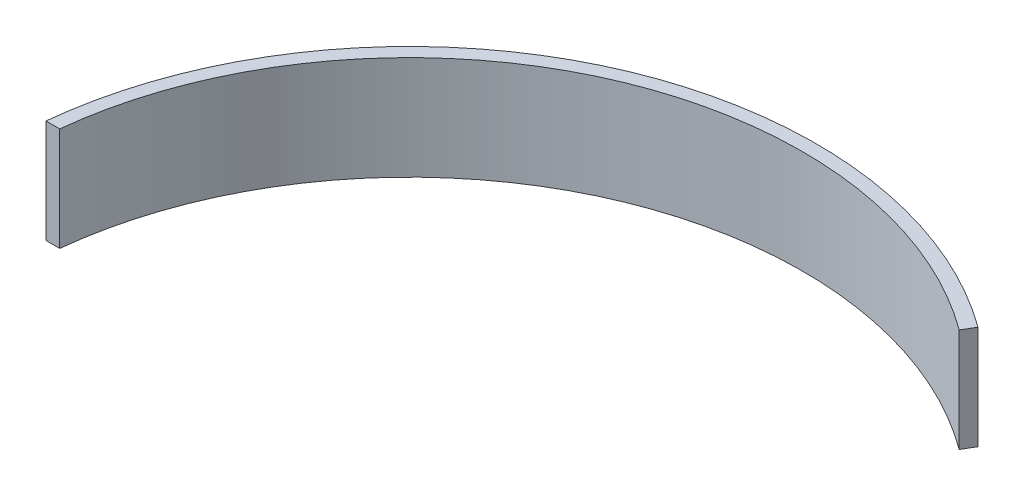
ISO-10303-21;
HEADER;
FILE_DESCRIPTION(('STEP AP214'),'2;1');
FILE_NAME('part.step','',(''),(''),'','','');
FILE_SCHEMA(('AUTOMOTIVE_DESIGN { 1 0 10303 214 1 1 1 1 }'));
ENDSEC;
DATA;
#1=APPLICATION_CONTEXT('core data for automotive mechanical design processes');
#2=APPLICATION_PROTOCOL_DEFINITION('international standard','automotive_design',2000,#1);
#3=PRODUCT_CONTEXT('',#1,'mechanical');
#4=PRODUCT('Part','Part','',(#3));
#5=PRODUCT_RELATED_PRODUCT_CATEGORY('part','',(#4));
#6=PRODUCT_DEFINITION_FORMATION('','',#4);
#7=PRODUCT_DEFINITION_CONTEXT('part definition',#1,'design');
#8=PRODUCT_DEFINITION('design','',#6,#7);
#9=PRODUCT_DEFINITION_SHAPE('','',#8);
#10=(LENGTH_UNIT() NAMED_UNIT(*) SI_UNIT(.MILLI.,.METRE.));
#11=(NAMED_UNIT(*) PLANE_ANGLE_UNIT() SI_UNIT($,.RADIAN.));
#12=(NAMED_UNIT(*) SI_UNIT($,.STERADIAN.) SOLID_ANGLE_UNIT());
#13=UNCERTAINTY_MEASURE_WITH_UNIT(LENGTH_MEASURE(1.E-05),#10,'distance_accuracy_value','');
#14=(GEOMETRIC_REPRESENTATION_CONTEXT(3) GLOBAL_UNCERTAINTY_ASSIGNED_CONTEXT((#13)) GLOBAL_UNIT_ASSIGNED_CONTEXT((#10,
#11,#12)) REPRESENTATION_CONTEXT('',''));
#15=CARTESIAN_POINT('',(0.,0.,0.));
#16=DIRECTION('',(0.,0.,1.));
#17=DIRECTION('',(1.,0.,0.));
#18=AXIS2_PLACEMENT_3D('',#15,#16,#17);
#19=CARTESIAN_POINT('',(0.,40.,0.));
#20=DIRECTION('',(0.,-1.,0.));
#21=DIRECTION('',(0.,0.,-1.));
#22=AXIS2_PLACEMENT_3D('',#19,#20,#21);
#23=CYLINDRICAL_SURFACE('',#22,152.);
#24=CARTESIAN_POINT('',(0.,0.,0.));
#25=DIRECTION('',(0.,-1.,0.));
#26=DIRECTION('',(0.,0.,-1.));
#27=AXIS2_PLACEMENT_3D('',#24,#25,#26);
#28=CIRCLE('',#27,152.);
#29=CARTESIAN_POINT('',(-151.143210884866,0.,-16.1161348782135));
#30=VERTEX_POINT('',#29);
#31=CARTESIAN_POINT('',(89.8661020016006,0.,-122.589084795662));
#32=VERTEX_POINT('',#31);
#33=EDGE_CURVE('E102',#30,#32,#28,.T.);
#34=ORIENTED_EDGE('',*,*,#33,.T.);
#35=DIRECTION('',(0.,-1.,0.));
#36=VECTOR('',#35,1.);
#37=CARTESIAN_POINT('',(89.8661020016006,40.,-122.589084795662));
#38=LINE('',#37,#36);
#39=CARTESIAN_POINT('',(89.8661020016006,40.,-122.589084795662));
#40=VERTEX_POINT('',#39);
#41=EDGE_CURVE('E11',#40,#32,#38,.T.);
#42=ORIENTED_EDGE('',*,*,#41,.F.);
#43=CARTESIAN_POINT('',(0.,40.,0.));
#44=DIRECTION('',(0.,-1.,0.));
#45=DIRECTION('',(0.,0.,-1.));
#46=AXIS2_PLACEMENT_3D('',#43,#44,#45);
#47=CIRCLE('',#46,152.);
#48=CARTESIAN_POINT('',(-151.143210884866,40.,-16.1161348782135));
#49=VERTEX_POINT('',#48);
#50=EDGE_CURVE('E87',#49,#40,#47,.T.);
#51=ORIENTED_EDGE('',*,*,#50,.F.);
#52=DIRECTION('',(0.,-1.,0.));
#53=VECTOR('',#52,1.);
#54=CARTESIAN_POINT('',(-151.143210884866,40.,-16.1161348782135));
#55=LINE('',#54,#53);
#56=EDGE_CURVE('E100',#49,#30,#55,.T.);
#57=ORIENTED_EDGE('',*,*,#56,.T.);
#58=EDGE_LOOP('',(#34,#42,#51,#57));
#59=FACE_BOUND('',#58,.T.);
#60=ADVANCED_FACE('F36',(#59),#23,.F.);
#61=CARTESIAN_POINT('',(92.5691046951454,40.,-127.146558322431));
#62=DIRECTION('',(-0.860102954130198,0.,-0.510120484098125));
#63=DIRECTION('',(-0.510120484098125,0.,0.860102954130199));
#64=AXIS2_PLACEMENT_3D('',#61,#62,#63);
#65=PLANE('',#64);
#66=DIRECTION('',(0.510120484098125,0.,-0.860102954130198));
#67=VECTOR('',#66,1.);
#68=CARTESIAN_POINT('',(92.5691046951454,0.,-127.146558322431));
#69=LINE('',#68,#67);
#70=CARTESIAN_POINT('',(92.5691046951453,0.,-127.146558322431));
#71=VERTEX_POINT('',#70);
#72=EDGE_CURVE('E93',#32,#71,#69,.T.);
#73=ORIENTED_EDGE('',*,*,#72,.T.);
#74=DIRECTION('',(0.,-1.,0.));
#75=VECTOR('',#74,1.);
#76=CARTESIAN_POINT('',(92.5691046951453,40.,-127.146558322431));
#77=LINE('',#76,#75);
#78=CARTESIAN_POINT('',(92.5691046951453,40.,-127.146558322431));
#79=VERTEX_POINT('',#78);
#80=EDGE_CURVE('E46',#79,#71,#77,.T.);
#81=ORIENTED_EDGE('',*,*,#80,.F.);
#82=DIRECTION('',(0.510120484098125,0.,-0.860102954130198));
#83=VECTOR('',#82,1.);
#84=CARTESIAN_POINT('',(92.5691046951454,40.,-127.146558322431));
#85=LINE('',#84,#83);
#86=EDGE_CURVE('E84',#40,#79,#85,.T.);
#87=ORIENTED_EDGE('',*,*,#86,.F.);
#88=ORIENTED_EDGE('',*,*,#41,.T.);
#89=EDGE_LOOP('',(#73,#81,#87,#88));
#90=FACE_BOUND('',#89,.T.);
#91=ADVANCED_FACE('F95',(#90),#65,.F.);
#92=CARTESIAN_POINT('',(0.,40.,0.));
#93=DIRECTION('',(0.,-1.,0.));
#94=DIRECTION('',(0.,0.,-1.));
#95=AXIS2_PLACEMENT_3D('',#92,#93,#94);
#96=CYLINDRICAL_SURFACE('',#95,157.274557501524);
#97=CARTESIAN_POINT('',(0.,0.,0.));
#98=DIRECTION('',(0.,1.,0.));
#99=DIRECTION('',(0.,0.,-1.));
#100=AXIS2_PLACEMENT_3D('',#97,#98,#99);
#101=CIRCLE('',#100,157.274557501524);
#102=CARTESIAN_POINT('',(-156.446657471124,0.,-16.1161348782135));
#103=VERTEX_POINT('',#102);
#104=EDGE_CURVE('E71',#71,#103,#101,.T.);
#105=ORIENTED_EDGE('',*,*,#104,.T.);
#106=DIRECTION('',(0.,-1.,0.));
#107=VECTOR('',#106,1.);
#108=CARTESIAN_POINT('',(-156.446657471124,40.,-16.1161348782135));
#109=LINE('',#108,#107);
#110=CARTESIAN_POINT('',(-156.446657471124,40.,-16.1161348782135));
#111=VERTEX_POINT('',#110);
#112=EDGE_CURVE('E92',#111,#103,#109,.T.);
#113=ORIENTED_EDGE('',*,*,#112,.F.);
#114=CARTESIAN_POINT('',(0.,40.,0.));
#115=DIRECTION('',(0.,1.,0.));
#116=DIRECTION('',(0.,0.,-1.));
#117=AXIS2_PLACEMENT_3D('',#114,#115,#116);
#118=CIRCLE('',#117,157.274557501524);
#119=EDGE_CURVE('E90',#79,#111,#118,.T.);
#120=ORIENTED_EDGE('',*,*,#119,.F.);
#121=ORIENTED_EDGE('',*,*,#80,.T.);
#122=EDGE_LOOP('',(#105,#113,#120,#121));
#123=FACE_BOUND('',#122,.T.);
#124=ADVANCED_FACE('F94',(#123),#96,.T.);
#125=CARTESIAN_POINT('',(-156.446657471124,40.,-16.1161348782135));
#126=DIRECTION('',(0.,0.,-1.));
#127=DIRECTION('',(-1.,0.,0.));
#128=AXIS2_PLACEMENT_3D('',#125,#126,#127);
#129=PLANE('',#128);
#130=DIRECTION('',(1.,0.,0.));
#131=VECTOR('',#130,1.);
#132=CARTESIAN_POINT('',(-156.446657471124,0.,-16.1161348782135));
#133=LINE('',#132,#131);
#134=EDGE_CURVE('E77',#103,#30,#133,.T.);
#135=ORIENTED_EDGE('',*,*,#134,.T.);
#136=ORIENTED_EDGE('',*,*,#56,.F.);
#137=DIRECTION('',(1.,0.,0.));
#138=VECTOR('',#137,1.);
#139=CARTESIAN_POINT('',(-156.446657471124,40.,-16.1161348782135));
#140=LINE('',#139,#138);
#141=EDGE_CURVE('E53',#111,#49,#140,.T.);
#142=ORIENTED_EDGE('',*,*,#141,.F.);
#143=ORIENTED_EDGE('',*,*,#112,.T.);
#144=EDGE_LOOP('',(#135,#136,#142,#143));
#145=FACE_BOUND('',#144,.T.);
#146=ADVANCED_FACE('F106',(#145),#129,.F.);
#147=CARTESIAN_POINT('',(0.,40.,0.));
#148=DIRECTION('',(0.,-1.,0.));
#149=DIRECTION('',(0.,0.,-1.));
#150=AXIS2_PLACEMENT_3D('',#147,#148,#149);
#151=PLANE('',#150);
#152=ORIENTED_EDGE('',*,*,#50,.T.);
#153=ORIENTED_EDGE('',*,*,#86,.T.);
#154=ORIENTED_EDGE('',*,*,#119,.T.);
#155=ORIENTED_EDGE('',*,*,#141,.T.);
#156=EDGE_LOOP('',(#152,#153,#154,#155));
#157=FACE_BOUND('',#156,.T.);
#158=ADVANCED_FACE('F82',(#157),#151,.F.);
#159=CARTESIAN_POINT('',(0.,0.,0.));
#160=DIRECTION('',(0.,-1.,0.));
#161=DIRECTION('',(0.,0.,-1.));
#162=AXIS2_PLACEMENT_3D('',#159,#160,#161);
#163=PLANE('',#162);
#164=ORIENTED_EDGE('',*,*,#33,.F.);
#165=ORIENTED_EDGE('',*,*,#134,.F.);
#166=ORIENTED_EDGE('',*,*,#104,.F.);
#167=ORIENTED_EDGE('',*,*,#72,.F.);
#168=EDGE_LOOP('',(#164,#165,#166,#167));
#169=FACE_BOUND('',#168,.T.);
#170=ADVANCED_FACE('F112',(#169),#163,.T.);
#171=CLOSED_SHELL('',(#60,#91,#124,#146,#158,#170));
#172=MANIFOLD_SOLID_BREP('B2',#171);
#173=ADVANCED_BREP_SHAPE_REPRESENTATION('',(#18,#172),#14);
#174=SHAPE_DEFINITION_REPRESENTATION(#9,#173);
ENDSEC;
END-ISO-10303-21;
